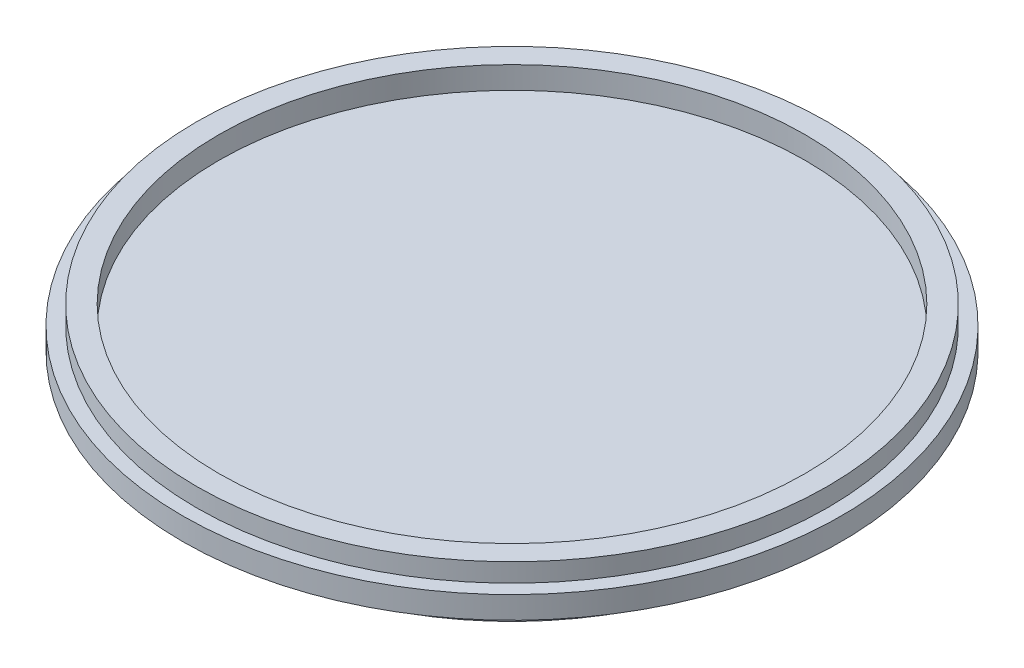
ISO-10303-21;
HEADER;
FILE_DESCRIPTION(('STEP AP214'),'2;1');
FILE_NAME('part.step','',(''),(''),'','','');
FILE_SCHEMA(('AUTOMOTIVE_DESIGN { 1 0 10303 214 1 1 1 1 }'));
ENDSEC;
DATA;
#1=APPLICATION_CONTEXT('core data for automotive mechanical design processes');
#2=APPLICATION_PROTOCOL_DEFINITION('international standard','automotive_design',2000,#1);
#3=PRODUCT_CONTEXT('',#1,'mechanical');
#4=PRODUCT('Part','Part','',(#3));
#5=PRODUCT_RELATED_PRODUCT_CATEGORY('part','',(#4));
#6=PRODUCT_DEFINITION_FORMATION('','',#4);
#7=PRODUCT_DEFINITION_CONTEXT('part definition',#1,'design');
#8=PRODUCT_DEFINITION('design','',#6,#7);
#9=PRODUCT_DEFINITION_SHAPE('','',#8);
#10=(LENGTH_UNIT() NAMED_UNIT(*) SI_UNIT(.MILLI.,.METRE.));
#11=(NAMED_UNIT(*) PLANE_ANGLE_UNIT() SI_UNIT($,.RADIAN.));
#12=(NAMED_UNIT(*) SI_UNIT($,.STERADIAN.) SOLID_ANGLE_UNIT());
#13=UNCERTAINTY_MEASURE_WITH_UNIT(LENGTH_MEASURE(1.E-05),#10,'distance_accuracy_value','');
#14=(GEOMETRIC_REPRESENTATION_CONTEXT(3) GLOBAL_UNCERTAINTY_ASSIGNED_CONTEXT((#13)) GLOBAL_UNIT_ASSIGNED_CONTEXT((#10,
#11,#12)) REPRESENTATION_CONTEXT('',''));
#15=CARTESIAN_POINT('',(0.,0.,0.));
#16=DIRECTION('',(0.,0.,1.));
#17=DIRECTION('',(1.,0.,0.));
#18=AXIS2_PLACEMENT_3D('',#15,#16,#17);
#19=CARTESIAN_POINT('',(0.,1.,0.));
#20=DIRECTION('',(0.,-1.,0.));
#21=DIRECTION('',(0.,0.,-1.));
#22=AXIS2_PLACEMENT_3D('',#19,#20,#21);
#23=CYLINDRICAL_SURFACE('',#22,15.8);
#24=CARTESIAN_POINT('',(0.,1.,0.));
#25=DIRECTION('',(0.,1.,0.));
#26=DIRECTION('',(0.,0.,1.));
#27=AXIS2_PLACEMENT_3D('',#24,#25,#26);
#28=CIRCLE('',#27,15.8);
#29=CARTESIAN_POINT('',(0.,1.,15.8));
#30=VERTEX_POINT('',#29);
#31=EDGE_CURVE('E41',#30,#30,#28,.T.);
#32=ORIENTED_EDGE('',*,*,#31,.T.);
#33=EDGE_LOOP('',(#32));
#34=FACE_BOUND('',#33,.T.);
#35=CARTESIAN_POINT('',(0.,-0.2,0.));
#36=DIRECTION('',(0.,-1.,0.));
#37=DIRECTION('',(0.,0.,-1.));
#38=AXIS2_PLACEMENT_3D('',#35,#36,#37);
#39=CIRCLE('',#38,15.8);
#40=CARTESIAN_POINT('',(0.,-0.2,-15.8));
#41=VERTEX_POINT('',#40);
#42=EDGE_CURVE('E61',#41,#41,#39,.T.);
#43=ORIENTED_EDGE('',*,*,#42,.T.);
#44=EDGE_LOOP('',(#43));
#45=FACE_BOUND('',#44,.T.);
#46=ADVANCED_FACE('F34',(#34,#45),#23,.F.);
#47=CARTESIAN_POINT('',(0.,1.,0.));
#48=DIRECTION('',(0.,1.,0.));
#49=DIRECTION('',(0.,0.,1.));
#50=AXIS2_PLACEMENT_3D('',#47,#48,#49);
#51=PLANE('',#50);
#52=CARTESIAN_POINT('',(0.,1.,0.));
#53=DIRECTION('',(0.,1.,0.));
#54=DIRECTION('',(0.,0.,1.));
#55=AXIS2_PLACEMENT_3D('',#52,#53,#54);
#56=CIRCLE('',#55,17.);
#57=CARTESIAN_POINT('',(0.,1.,17.));
#58=VERTEX_POINT('',#57);
#59=EDGE_CURVE('E10',#58,#58,#56,.T.);
#60=ORIENTED_EDGE('',*,*,#59,.T.);
#61=EDGE_LOOP('',(#60));
#62=FACE_BOUND('',#61,.T.);
#63=ORIENTED_EDGE('',*,*,#31,.F.);
#64=EDGE_LOOP('',(#63));
#65=FACE_BOUND('',#64,.T.);
#66=ADVANCED_FACE('F85',(#62,#65),#51,.T.);
#67=CARTESIAN_POINT('',(0.,1.,0.));
#68=DIRECTION('',(0.,-1.,0.));
#69=DIRECTION('',(0.,0.,-1.));
#70=AXIS2_PLACEMENT_3D('',#67,#68,#69);
#71=CYLINDRICAL_SURFACE('',#70,17.);
#72=ORIENTED_EDGE('',*,*,#59,.F.);
#73=EDGE_LOOP('',(#72));
#74=FACE_BOUND('',#73,.T.);
#75=CARTESIAN_POINT('',(0.,0.,0.));
#76=DIRECTION('',(0.,-1.,0.));
#77=DIRECTION('',(0.,0.,-1.));
#78=AXIS2_PLACEMENT_3D('',#75,#76,#77);
#79=CIRCLE('',#78,17.);
#80=CARTESIAN_POINT('',(0.,0.,-17.));
#81=VERTEX_POINT('',#80);
#82=EDGE_CURVE('E45',#81,#81,#79,.T.);
#83=ORIENTED_EDGE('',*,*,#82,.F.);
#84=EDGE_LOOP('',(#83));
#85=FACE_BOUND('',#84,.T.);
#86=ADVANCED_FACE('F36',(#74,#85),#71,.T.);
#87=CARTESIAN_POINT('',(0.,0.,0.));
#88=DIRECTION('',(0.,-1.,0.));
#89=DIRECTION('',(0.,0.,-1.));
#90=AXIS2_PLACEMENT_3D('',#87,#88,#89);
#91=PLANE('',#90);
#92=CARTESIAN_POINT('',(0.,0.,0.));
#93=DIRECTION('',(0.,-1.,0.));
#94=DIRECTION('',(0.,0.,-1.));
#95=AXIS2_PLACEMENT_3D('',#92,#93,#94);
#96=CIRCLE('',#95,17.75);
#97=CARTESIAN_POINT('',(0.,0.,-17.75));
#98=VERTEX_POINT('',#97);
#99=EDGE_CURVE('E52',#98,#98,#96,.T.);
#100=ORIENTED_EDGE('',*,*,#99,.F.);
#101=EDGE_LOOP('',(#100));
#102=FACE_BOUND('',#101,.T.);
#103=ORIENTED_EDGE('',*,*,#82,.T.);
#104=EDGE_LOOP('',(#103));
#105=FACE_BOUND('',#104,.T.);
#106=ADVANCED_FACE('F98',(#102,#105),#91,.F.);
#107=CARTESIAN_POINT('',(0.,-1.2,0.));
#108=DIRECTION('',(0.,-1.,0.));
#109=DIRECTION('',(0.,0.,-1.));
#110=AXIS2_PLACEMENT_3D('',#107,#108,#109);
#111=PLANE('',#110);
#112=CARTESIAN_POINT('',(0.,-1.2,0.));
#113=DIRECTION('',(0.,-1.,0.));
#114=DIRECTION('',(0.,0.,-1.));
#115=AXIS2_PLACEMENT_3D('',#112,#113,#114);
#116=CIRCLE('',#115,16.75);
#117=CARTESIAN_POINT('',(0.,-1.2,-16.75));
#118=VERTEX_POINT('',#117);
#119=EDGE_CURVE('E58',#118,#118,#116,.T.);
#120=ORIENTED_EDGE('',*,*,#119,.F.);
#121=EDGE_LOOP('',(#120));
#122=FACE_BOUND('',#121,.T.);
#123=CARTESIAN_POINT('',(0.,-1.2,0.));
#124=DIRECTION('',(0.,-1.,0.));
#125=DIRECTION('',(0.,0.,-1.));
#126=AXIS2_PLACEMENT_3D('',#123,#124,#125);
#127=CIRCLE('',#126,17.75);
#128=CARTESIAN_POINT('',(0.,-1.2,-17.75));
#129=VERTEX_POINT('',#128);
#130=EDGE_CURVE('E49',#129,#129,#127,.T.);
#131=ORIENTED_EDGE('',*,*,#130,.T.);
#132=EDGE_LOOP('',(#131));
#133=FACE_BOUND('',#132,.T.);
#134=ADVANCED_FACE('F96',(#122,#133),#111,.T.);
#135=CARTESIAN_POINT('',(0.,-1.2,0.));
#136=DIRECTION('',(0.,1.,0.));
#137=DIRECTION('',(0.,0.,1.));
#138=AXIS2_PLACEMENT_3D('',#135,#136,#137);
#139=CYLINDRICAL_SURFACE('',#138,17.75);
#140=ORIENTED_EDGE('',*,*,#130,.F.);
#141=EDGE_LOOP('',(#140));
#142=FACE_BOUND('',#141,.T.);
#143=ORIENTED_EDGE('',*,*,#99,.T.);
#144=EDGE_LOOP('',(#143));
#145=FACE_BOUND('',#144,.T.);
#146=ADVANCED_FACE('F92',(#142,#145),#139,.T.);
#147=CARTESIAN_POINT('',(0.,-0.7,0.));
#148=DIRECTION('',(0.,-1.,0.));
#149=DIRECTION('',(0.,0.,-1.));
#150=AXIS2_PLACEMENT_3D('',#147,#148,#149);
#151=CYLINDRICAL_SURFACE('',#150,16.75);
#152=CARTESIAN_POINT('',(0.,-0.7,0.));
#153=DIRECTION('',(0.,-1.,0.));
#154=DIRECTION('',(0.,0.,-1.));
#155=AXIS2_PLACEMENT_3D('',#152,#153,#154);
#156=CIRCLE('',#155,16.75);
#157=CARTESIAN_POINT('',(0.,-0.7,-16.75));
#158=VERTEX_POINT('',#157);
#159=EDGE_CURVE('E55',#158,#158,#156,.T.);
#160=ORIENTED_EDGE('',*,*,#159,.F.);
#161=EDGE_LOOP('',(#160));
#162=FACE_BOUND('',#161,.T.);
#163=ORIENTED_EDGE('',*,*,#119,.T.);
#164=EDGE_LOOP('',(#163));
#165=FACE_BOUND('',#164,.T.);
#166=ADVANCED_FACE('F95',(#162,#165),#151,.F.);
#167=CARTESIAN_POINT('',(0.,-0.7,0.));
#168=DIRECTION('',(0.,-1.,0.));
#169=DIRECTION('',(0.,0.,-1.));
#170=AXIS2_PLACEMENT_3D('',#167,#168,#169);
#171=PLANE('',#170);
#172=ORIENTED_EDGE('',*,*,#159,.T.);
#173=EDGE_LOOP('',(#172));
#174=FACE_BOUND('',#173,.T.);
#175=CARTESIAN_POINT('',(0.,-0.7,0.));
#176=DIRECTION('',(0.,-1.,0.));
#177=DIRECTION('',(0.,0.,-1.));
#178=AXIS2_PLACEMENT_3D('',#175,#176,#177);
#179=CIRCLE('',#178,15.);
#180=CARTESIAN_POINT('',(0.,-0.7,-15.));
#181=VERTEX_POINT('',#180);
#182=EDGE_CURVE('E66',#181,#181,#179,.T.);
#183=ORIENTED_EDGE('',*,*,#182,.F.);
#184=EDGE_LOOP('',(#183));
#185=FACE_BOUND('',#184,.T.);
#186=ADVANCED_FACE('F107',(#174,#185),#171,.T.);
#187=CARTESIAN_POINT('',(0.,-0.2,0.));
#188=DIRECTION('',(0.,-1.,0.));
#189=DIRECTION('',(0.,0.,-1.));
#190=AXIS2_PLACEMENT_3D('',#187,#188,#189);
#191=PLANE('',#190);
#192=ORIENTED_EDGE('',*,*,#42,.F.);
#193=EDGE_LOOP('',(#192));
#194=FACE_BOUND('',#193,.T.);
#195=ADVANCED_FACE('F81',(#194),#191,.F.);
#196=CARTESIAN_POINT('',(0.,-3.2,0.));
#197=DIRECTION('',(0.,1.,0.));
#198=DIRECTION('',(0.,0.,1.));
#199=AXIS2_PLACEMENT_3D('',#196,#197,#198);
#200=CYLINDRICAL_SURFACE('',#199,15.);
#201=ORIENTED_EDGE('',*,*,#182,.T.);
#202=EDGE_LOOP('',(#201));
#203=FACE_BOUND('',#202,.T.);
#204=CARTESIAN_POINT('',(0.,-3.2,0.));
#205=DIRECTION('',(0.,1.,0.));
#206=DIRECTION('',(0.,0.,1.));
#207=AXIS2_PLACEMENT_3D('',#204,#205,#206);
#208=CIRCLE('',#207,15.);
#209=CARTESIAN_POINT('',(0.,-3.2,15.));
#210=VERTEX_POINT('',#209);
#211=EDGE_CURVE('E69',#210,#210,#208,.T.);
#212=ORIENTED_EDGE('',*,*,#211,.T.);
#213=EDGE_LOOP('',(#212));
#214=FACE_BOUND('',#213,.T.);
#215=ADVANCED_FACE('F73',(#203,#214),#200,.T.);
#216=CARTESIAN_POINT('',(0.,-3.2,0.));
#217=DIRECTION('',(0.,1.,0.));
#218=DIRECTION('',(0.,0.,1.));
#219=AXIS2_PLACEMENT_3D('',#216,#217,#218);
#220=PLANE('',#219);
#221=ORIENTED_EDGE('',*,*,#211,.F.);
#222=EDGE_LOOP('',(#221));
#223=FACE_BOUND('',#222,.T.);
#224=ADVANCED_FACE('F75',(#223),#220,.F.);
#225=CLOSED_SHELL('',(#46,#66,#86,#106,#134,#146,#166,#186,#195,#215,#224));
#226=MANIFOLD_SOLID_BREP('B2',#225);
#227=ADVANCED_BREP_SHAPE_REPRESENTATION('',(#18,#226),#14);
#228=SHAPE_DEFINITION_REPRESENTATION(#9,#227);
ENDSEC;
END-ISO-10303-21;
